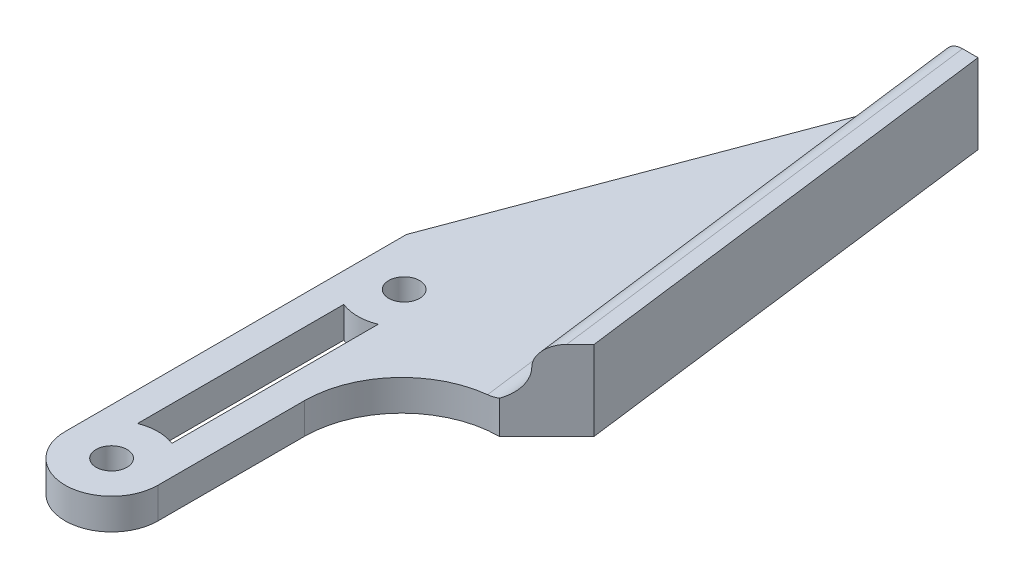
ISO-10303-21;
HEADER;
FILE_DESCRIPTION(('STEP AP214'),'2;1');
FILE_NAME('part.step','',(''),(''),'','','');
FILE_SCHEMA(('AUTOMOTIVE_DESIGN { 1 0 10303 214 1 1 1 1 }'));
ENDSEC;
DATA;
#1=APPLICATION_CONTEXT('core data for automotive mechanical design processes');
#2=APPLICATION_PROTOCOL_DEFINITION('international standard','automotive_design',2000,#1);
#3=PRODUCT_CONTEXT('',#1,'mechanical');
#4=PRODUCT('Part','Part','',(#3));
#5=PRODUCT_RELATED_PRODUCT_CATEGORY('part','',(#4));
#6=PRODUCT_DEFINITION_FORMATION('','',#4);
#7=PRODUCT_DEFINITION_CONTEXT('part definition',#1,'design');
#8=PRODUCT_DEFINITION('design','',#6,#7);
#9=PRODUCT_DEFINITION_SHAPE('','',#8);
#10=(LENGTH_UNIT() NAMED_UNIT(*) SI_UNIT(.MILLI.,.METRE.));
#11=(NAMED_UNIT(*) PLANE_ANGLE_UNIT() SI_UNIT($,.RADIAN.));
#12=(NAMED_UNIT(*) SI_UNIT($,.STERADIAN.) SOLID_ANGLE_UNIT());
#13=UNCERTAINTY_MEASURE_WITH_UNIT(LENGTH_MEASURE(1.E-05),#10,'distance_accuracy_value','');
#14=(GEOMETRIC_REPRESENTATION_CONTEXT(3) GLOBAL_UNCERTAINTY_ASSIGNED_CONTEXT((#13)) GLOBAL_UNIT_ASSIGNED_CONTEXT((#10,
#11,#12)) REPRESENTATION_CONTEXT('',''));
#15=CARTESIAN_POINT('',(0.,0.,0.));
#16=DIRECTION('',(0.,0.,1.));
#17=DIRECTION('',(1.,0.,0.));
#18=AXIS2_PLACEMENT_3D('',#15,#16,#17);
#19=CARTESIAN_POINT('',(7.025,3.175,20.));
#20=DIRECTION('',(0.,-1.,0.));
#21=DIRECTION('',(0.,0.,-1.));
#22=AXIS2_PLACEMENT_3D('',#19,#20,#21);
#23=PLANE('',#22);
#24=CARTESIAN_POINT('',(-7.7375,3.175,35.));
#25=DIRECTION('',(0.,1.,0.));
#26=DIRECTION('',(0.,0.,1.));
#27=AXIS2_PLACEMENT_3D('',#24,#25,#26);
#28=CIRCLE('',#27,1.5875);
#29=CARTESIAN_POINT('',(-7.7375,3.175,36.5875));
#30=VERTEX_POINT('',#29);
#31=EDGE_CURVE('E204',#30,#30,#28,.T.);
#32=ORIENTED_EDGE('',*,*,#31,.F.);
#33=EDGE_LOOP('',(#32));
#34=FACE_BOUND('',#33,.T.);
#35=CARTESIAN_POINT('',(-7.7375,3.175,5.00000000000001));
#36=DIRECTION('',(0.,1.,0.));
#37=DIRECTION('',(0.,0.,1.));
#38=AXIS2_PLACEMENT_3D('',#35,#36,#37);
#39=CIRCLE('',#38,1.5875);
#40=CARTESIAN_POINT('',(-7.7375,3.175,6.58750000000001));
#41=VERTEX_POINT('',#40);
#42=EDGE_CURVE('E210',#41,#41,#39,.T.);
#43=ORIENTED_EDGE('',*,*,#42,.F.);
#44=EDGE_LOOP('',(#43));
#45=FACE_BOUND('',#44,.T.);
#46=CARTESIAN_POINT('',(-7.7375,3.175,35.));
#47=DIRECTION('',(0.,1.,0.));
#48=DIRECTION('',(0.,0.,1.));
#49=AXIS2_PLACEMENT_3D('',#46,#47,#48);
#50=CIRCLE('',#49,4.7625);
#51=CARTESIAN_POINT('',(-5.97499999999999,3.175,30.5756356388742));
#52=VERTEX_POINT('',#51);
#53=CARTESIAN_POINT('',(-9.5,3.175,30.5756356388742));
#54=VERTEX_POINT('',#53);
#55=EDGE_CURVE('E179',#52,#54,#50,.T.);
#56=ORIENTED_EDGE('',*,*,#55,.T.);
#57=DIRECTION('',(0.,0.,1.));
#58=VECTOR('',#57,1.);
#59=CARTESIAN_POINT('',(-9.5,3.175,0.));
#60=LINE('',#59,#58);
#61=CARTESIAN_POINT('',(-9.5,3.175,9.42705531363683));
#62=VERTEX_POINT('',#61);
#63=EDGE_CURVE('E188',#62,#54,#60,.T.);
#64=ORIENTED_EDGE('',*,*,#63,.F.);
#65=CARTESIAN_POINT('',(-7.7375,3.175,5.00000000000001));
#66=DIRECTION('',(0.,1.,0.));
#67=DIRECTION('',(0.,0.,1.));
#68=AXIS2_PLACEMENT_3D('',#65,#66,#67);
#69=CIRCLE('',#68,4.76499999999999);
#70=CARTESIAN_POINT('',(-5.97500000000001,3.175,9.42705531363683));
#71=VERTEX_POINT('',#70);
#72=EDGE_CURVE('E185',#62,#71,#69,.T.);
#73=ORIENTED_EDGE('',*,*,#72,.T.);
#74=DIRECTION('',(0.,0.,1.));
#75=VECTOR('',#74,1.);
#76=CARTESIAN_POINT('',(-5.975,3.175,0.));
#77=LINE('',#76,#75);
#78=EDGE_CURVE('E182',#71,#52,#77,.T.);
#79=ORIENTED_EDGE('',*,*,#78,.T.);
#80=EDGE_LOOP('',(#56,#64,#73,#79));
#81=FACE_BOUND('',#80,.T.);
#82=CARTESIAN_POINT('',(7.025,3.175,20.));
#83=DIRECTION('',(0.,-1.,0.));
#84=DIRECTION('',(0.,0.,-1.));
#85=AXIS2_PLACEMENT_3D('',#82,#83,#84);
#86=CIRCLE('',#85,10.);
#87=CARTESIAN_POINT('',(-2.975,3.175,20.));
#88=VERTEX_POINT('',#87);
#89=CARTESIAN_POINT('',(5.88388487421905,3.175,10.065320525064));
#90=VERTEX_POINT('',#89);
#91=EDGE_CURVE('E218',#88,#90,#86,.T.);
#92=ORIENTED_EDGE('',*,*,#91,.T.);
#93=DIRECTION('',(0.126964135465405,0.,0.991907308323476));
#94=VECTOR('',#93,1.);
#95=CARTESIAN_POINT('',(-0.475721924970433,3.175,-39.6191075936038));
#96=LINE('',#95,#94);
#97=CARTESIAN_POINT('',(0.245171854133337,3.175,-33.9871249443556));
#98=VERTEX_POINT('',#97);
#99=EDGE_CURVE('E265',#90,#98,#96,.F.);
#100=ORIENTED_EDGE('',*,*,#99,.T.);
#101=DIRECTION('',(-0.351123441588392,0.,0.936329177569045));
#102=VECTOR('',#101,1.);
#103=CARTESIAN_POINT('',(2.49999999999999,3.175,-40.));
#104=LINE('',#103,#102);
#105=CARTESIAN_POINT('',(-12.5,3.175,0.));
#106=VERTEX_POINT('',#105);
#107=EDGE_CURVE('E222',#98,#106,#104,.T.);
#108=ORIENTED_EDGE('',*,*,#107,.T.);
#109=DIRECTION('',(0.,0.,1.));
#110=VECTOR('',#109,1.);
#111=CARTESIAN_POINT('',(-12.5,3.175,0.));
#112=LINE('',#111,#110);
#113=CARTESIAN_POINT('',(-12.5,3.175,35.));
#114=VERTEX_POINT('',#113);
#115=EDGE_CURVE('E224',#106,#114,#112,.T.);
#116=ORIENTED_EDGE('',*,*,#115,.T.);
#117=CARTESIAN_POINT('',(-7.7375,3.175,35.));
#118=DIRECTION('',(0.,1.,0.));
#119=DIRECTION('',(0.,0.,1.));
#120=AXIS2_PLACEMENT_3D('',#117,#118,#119);
#121=CIRCLE('',#120,4.76250000000001);
#122=CARTESIAN_POINT('',(-2.975,3.175,35.));
#123=VERTEX_POINT('',#122);
#124=EDGE_CURVE('E173',#114,#123,#121,.T.);
#125=ORIENTED_EDGE('',*,*,#124,.T.);
#126=DIRECTION('',(0.,0.,-1.));
#127=VECTOR('',#126,1.);
#128=CARTESIAN_POINT('',(-2.975,3.175,40.));
#129=LINE('',#128,#127);
#130=EDGE_CURVE('E216',#123,#88,#129,.T.);
#131=ORIENTED_EDGE('',*,*,#130,.T.);
#132=EDGE_LOOP('',(#92,#100,#108,#116,#125,#131));
#133=FACE_BOUND('',#132,.T.);
#134=ADVANCED_FACE('F36',(#34,#45,#81,#133),#23,.F.);
#135=CARTESIAN_POINT('',(7.025,0.,20.));
#136=DIRECTION('',(0.,-1.,0.));
#137=DIRECTION('',(0.,0.,-1.));
#138=AXIS2_PLACEMENT_3D('',#135,#136,#137);
#139=PLANE('',#138);
#140=DIRECTION('',(0.707106781186551,0.,-0.707106781186544));
#141=VECTOR('',#140,1.);
#142=CARTESIAN_POINT('',(2.025,0.,15.));
#143=LINE('',#142,#141);
#144=CARTESIAN_POINT('',(7.025,0.,10.));
#145=VERTEX_POINT('',#144);
#146=CARTESIAN_POINT('',(11.8787234042553,0.,5.14627659574474));
#147=VERTEX_POINT('',#146);
#148=EDGE_CURVE('E158',#145,#147,#143,.T.);
#149=ORIENTED_EDGE('',*,*,#148,.F.);
#150=CARTESIAN_POINT('',(7.025,0.,20.));
#151=DIRECTION('',(0.,-1.,0.));
#152=DIRECTION('',(0.,0.,-1.));
#153=AXIS2_PLACEMENT_3D('',#150,#151,#152);
#154=CIRCLE('',#153,10.);
#155=CARTESIAN_POINT('',(-2.975,0.,20.));
#156=VERTEX_POINT('',#155);
#157=EDGE_CURVE('E229',#156,#145,#154,.T.);
#158=ORIENTED_EDGE('',*,*,#157,.F.);
#159=DIRECTION('',(0.,0.,-1.));
#160=VECTOR('',#159,1.);
#161=CARTESIAN_POINT('',(-2.975,0.,40.));
#162=LINE('',#161,#160);
#163=CARTESIAN_POINT('',(-2.975,0.,35.));
#164=VERTEX_POINT('',#163);
#165=EDGE_CURVE('E213',#164,#156,#162,.T.);
#166=ORIENTED_EDGE('',*,*,#165,.F.);
#167=CARTESIAN_POINT('',(-7.7375,0.,35.));
#168=DIRECTION('',(0.,-1.,0.));
#169=DIRECTION('',(0.,0.,-1.));
#170=AXIS2_PLACEMENT_3D('',#167,#168,#169);
#171=CIRCLE('',#170,4.76250000000001);
#172=CARTESIAN_POINT('',(-12.5,0.,35.));
#173=VERTEX_POINT('',#172);
#174=EDGE_CURVE('E176',#164,#173,#171,.T.);
#175=ORIENTED_EDGE('',*,*,#174,.T.);
#176=DIRECTION('',(0.,0.,1.));
#177=VECTOR('',#176,1.);
#178=CARTESIAN_POINT('',(-12.5,0.,0.));
#179=LINE('',#178,#177);
#180=CARTESIAN_POINT('',(-12.5,0.,0.));
#181=VERTEX_POINT('',#180);
#182=EDGE_CURVE('E219',#181,#173,#179,.T.);
#183=ORIENTED_EDGE('',*,*,#182,.F.);
#184=DIRECTION('',(-0.351123441588392,0.,0.936329177569045));
#185=VECTOR('',#184,1.);
#186=CARTESIAN_POINT('',(2.49999999999999,0.,-40.));
#187=LINE('',#186,#185);
#188=CARTESIAN_POINT('',(2.49999999999999,0.,-40.));
#189=VERTEX_POINT('',#188);
#190=EDGE_CURVE('E233',#189,#181,#187,.T.);
#191=ORIENTED_EDGE('',*,*,#190,.F.);
#192=DIRECTION('',(-1.,0.,0.));
#193=VECTOR('',#192,1.);
#194=CARTESIAN_POINT('',(12.5,0.,-40.));
#195=LINE('',#194,#193);
#196=CARTESIAN_POINT('',(6.09999999999999,0.,-40.));
#197=VERTEX_POINT('',#196);
#198=EDGE_CURVE('E231',#197,#189,#195,.T.);
#199=ORIENTED_EDGE('',*,*,#198,.F.);
#200=DIRECTION('',(0.126964135465405,0.,0.991907308323476));
#201=VECTOR('',#200,1.);
#202=CARTESIAN_POINT('',(12.5,0.,10.));
#203=LINE('',#202,#201);
#204=EDGE_CURVE('E194',#197,#147,#203,.T.);
#205=ORIENTED_EDGE('',*,*,#204,.T.);
#206=EDGE_LOOP('',(#149,#158,#166,#175,#183,#191,#199,#205));
#207=FACE_BOUND('',#206,.T.);
#208=DIRECTION('',(0.,0.,-1.));
#209=VECTOR('',#208,1.);
#210=CARTESIAN_POINT('',(-9.5,0.,20.));
#211=LINE('',#210,#209);
#212=CARTESIAN_POINT('',(-9.5,0.,30.5756356388742));
#213=VERTEX_POINT('',#212);
#214=CARTESIAN_POINT('',(-9.5,0.,9.42705531363683));
#215=VERTEX_POINT('',#214);
#216=EDGE_CURVE('E250',#213,#215,#211,.T.);
#217=ORIENTED_EDGE('',*,*,#216,.F.);
#218=CARTESIAN_POINT('',(-7.7375,0.,35.));
#219=DIRECTION('',(0.,-1.,0.));
#220=DIRECTION('',(0.,0.,-1.));
#221=AXIS2_PLACEMENT_3D('',#218,#219,#220);
#222=CIRCLE('',#221,4.7625);
#223=CARTESIAN_POINT('',(-5.97499999999999,0.,30.5756356388742));
#224=VERTEX_POINT('',#223);
#225=EDGE_CURVE('E252',#213,#224,#222,.T.);
#226=ORIENTED_EDGE('',*,*,#225,.T.);
#227=DIRECTION('',(0.,0.,-1.));
#228=VECTOR('',#227,1.);
#229=CARTESIAN_POINT('',(-5.97499999999999,0.,20.));
#230=LINE('',#229,#228);
#231=CARTESIAN_POINT('',(-5.975,0.,9.42705531363683));
#232=VERTEX_POINT('',#231);
#233=EDGE_CURVE('E244',#224,#232,#230,.T.);
#234=ORIENTED_EDGE('',*,*,#233,.T.);
#235=CARTESIAN_POINT('',(-7.7375,0.,5.00000000000001));
#236=DIRECTION('',(0.,-1.,0.));
#237=DIRECTION('',(0.,0.,-1.));
#238=AXIS2_PLACEMENT_3D('',#235,#236,#237);
#239=CIRCLE('',#238,4.76499999999999);
#240=EDGE_CURVE('E247',#232,#215,#239,.T.);
#241=ORIENTED_EDGE('',*,*,#240,.T.);
#242=EDGE_LOOP('',(#217,#226,#234,#241));
#243=FACE_BOUND('',#242,.T.);
#244=CARTESIAN_POINT('',(-7.7375,0.,5.00000000000001));
#245=DIRECTION('',(0.,1.,0.));
#246=DIRECTION('',(0.,0.,1.));
#247=AXIS2_PLACEMENT_3D('',#244,#245,#246);
#248=CIRCLE('',#247,1.5875);
#249=CARTESIAN_POINT('',(-7.7375,0.,6.58750000000001));
#250=VERTEX_POINT('',#249);
#251=EDGE_CURVE('E207',#250,#250,#248,.T.);
#252=ORIENTED_EDGE('',*,*,#251,.T.);
#253=EDGE_LOOP('',(#252));
#254=FACE_BOUND('',#253,.T.);
#255=CARTESIAN_POINT('',(-7.7375,0.,35.));
#256=DIRECTION('',(0.,1.,0.));
#257=DIRECTION('',(0.,0.,1.));
#258=AXIS2_PLACEMENT_3D('',#255,#256,#257);
#259=CIRCLE('',#258,1.5875);
#260=CARTESIAN_POINT('',(-7.7375,0.,36.5875));
#261=VERTEX_POINT('',#260);
#262=EDGE_CURVE('E203',#261,#261,#259,.T.);
#263=ORIENTED_EDGE('',*,*,#262,.T.);
#264=EDGE_LOOP('',(#263));
#265=FACE_BOUND('',#264,.T.);
#266=ADVANCED_FACE('F282',(#207,#243,#254,#265),#139,.T.);
#267=CARTESIAN_POINT('',(-2.975,3.175,40.));
#268=DIRECTION('',(-1.,0.,0.));
#269=DIRECTION('',(0.,0.,1.));
#270=AXIS2_PLACEMENT_3D('',#267,#268,#269);
#271=PLANE('',#270);
#272=DIRECTION('',(0.,1.,0.));
#273=VECTOR('',#272,1.);
#274=CARTESIAN_POINT('',(-2.975,-6.825,35.));
#275=LINE('',#274,#273);
#276=EDGE_CURVE('E171',#164,#123,#275,.T.);
#277=ORIENTED_EDGE('',*,*,#276,.F.);
#278=ORIENTED_EDGE('',*,*,#165,.T.);
#279=DIRECTION('',(0.,-1.,0.));
#280=VECTOR('',#279,1.);
#281=CARTESIAN_POINT('',(-2.975,3.175,20.));
#282=LINE('',#281,#280);
#283=EDGE_CURVE('E241',#88,#156,#282,.T.);
#284=ORIENTED_EDGE('',*,*,#283,.F.);
#285=ORIENTED_EDGE('',*,*,#130,.F.);
#286=EDGE_LOOP('',(#277,#278,#284,#285));
#287=FACE_BOUND('',#286,.T.);
#288=ADVANCED_FACE('F279',(#287),#271,.F.);
#289=CARTESIAN_POINT('',(7.025,3.175,20.));
#290=DIRECTION('',(0.,-1.,0.));
#291=DIRECTION('',(0.,0.,-1.));
#292=AXIS2_PLACEMENT_3D('',#289,#290,#291);
#293=CYLINDRICAL_SURFACE('',#292,10.);
#294=ORIENTED_EDGE('',*,*,#157,.T.);
#295=DIRECTION('',(0.,-1.,0.));
#296=VECTOR('',#295,1.);
#297=CARTESIAN_POINT('',(7.025,3.175,10.));
#298=LINE('',#297,#296);
#299=CARTESIAN_POINT('',(7.025,3.40011194588368,10.));
#300=VERTEX_POINT('',#299);
#301=EDGE_CURVE('E60',#300,#145,#298,.T.);
#302=ORIENTED_EDGE('',*,*,#301,.F.);
#303=CARTESIAN_POINT('',(7.025,3.40011194588368,10.));
#304=CARTESIAN_POINT('',(6.94857850855718,3.3689551615525,9.99999167668518));
#305=CARTESIAN_POINT('',(6.87089017113675,3.34088685509777,10.0008756179961));
#306=CARTESIAN_POINT('',(6.71348263132809,3.29110632223128,10.0045453354105));
#307=CARTESIAN_POINT('',(6.63376192983926,3.26939894437881,10.0073325569106));
#308=CARTESIAN_POINT('',(6.47426222235149,3.23287691252863,10.0148626859859));
#309=CARTESIAN_POINT('',(6.39450671897227,3.21795253628088,10.0195719343516));
#310=CARTESIAN_POINT('',(6.23423966783054,3.1946069597486,10.0309910264252));
#311=CARTESIAN_POINT('',(6.15372874657802,3.18618078248694,10.0376993335812));
#312=CARTESIAN_POINT('',(6.04164922397388,3.17902941531998,10.0484159936705));
#313=CARTESIAN_POINT('',(6.01015666833825,3.17752168581298,10.0515781910893));
#314=CARTESIAN_POINT('',(5.94706649949416,3.17550539323334,10.058216049866));
#315=CARTESIAN_POINT('',(5.91546888555266,3.17500017305149,10.0616927196885));
#316=CARTESIAN_POINT('',(5.88388487421905,3.175,10.065320525064));
#317=B_SPLINE_CURVE_WITH_KNOTS('',3,(#303,#304,#305,#306,#307,#308,#309,#310,#311,#312,#313,
#314,#315,#316),.UNSPECIFIED.,.F.,.F.,(4,2,2,2,2,2,4),(0.,0.247526549039769,0.495241285032523,
0.7387923564131,0.982156706015518,1.07720350735931,1.17256671542735),.UNSPECIFIED.);
#318=EDGE_CURVE('E45',#300,#90,#317,.T.);
#319=ORIENTED_EDGE('',*,*,#318,.T.);
#320=ORIENTED_EDGE('',*,*,#91,.F.);
#321=ORIENTED_EDGE('',*,*,#283,.T.);
#322=EDGE_LOOP('',(#294,#302,#319,#320,#321));
#323=FACE_BOUND('',#322,.T.);
#324=ADVANCED_FACE('F273',(#323),#293,.F.);
#325=CARTESIAN_POINT('',(12.5,3.175,-40.));
#326=DIRECTION('',(0.,0.,1.));
#327=DIRECTION('',(1.,0.,0.));
#328=AXIS2_PLACEMENT_3D('',#325,#326,#327);
#329=PLANE('',#328);
#330=DIRECTION('',(0.,-1.,0.));
#331=VECTOR('',#330,1.);
#332=CARTESIAN_POINT('',(2.49999999999999,3.175,-40.));
#333=LINE('',#332,#331);
#334=CARTESIAN_POINT('',(2.49999999999999,6.175,-40.));
#335=VERTEX_POINT('',#334);
#336=EDGE_CURVE('E52',#335,#189,#333,.T.);
#337=ORIENTED_EDGE('',*,*,#336,.F.);
#338=CARTESIAN_POINT('',(4.51631743532609,6.175,-40.));
#339=DIRECTION('',(0.,0.,1.));
#340=DIRECTION('',(-1.,0.,0.));
#341=AXIS2_PLACEMENT_3D('',#338,#339,#340);
#342=ELLIPSE('',#341,2.01631743532609,2.);
#343=CARTESIAN_POINT('',(4.51631743532609,8.175,-40.));
#344=VERTEX_POINT('',#343);
#345=EDGE_CURVE('E263',#335,#344,#342,.F.);
#346=ORIENTED_EDGE('',*,*,#345,.T.);
#347=DIRECTION('',(-1.,0.,0.));
#348=VECTOR('',#347,1.);
#349=CARTESIAN_POINT('',(6.09999999999999,8.175,-40.));
#350=LINE('',#349,#348);
#351=CARTESIAN_POINT('',(6.09999999999999,8.175,-40.));
#352=VERTEX_POINT('',#351);
#353=EDGE_CURVE('E166',#352,#344,#350,.T.);
#354=ORIENTED_EDGE('',*,*,#353,.F.);
#355=DIRECTION('',(0.,1.,0.));
#356=VECTOR('',#355,1.);
#357=CARTESIAN_POINT('',(6.09999999999999,0.,-40.));
#358=LINE('',#357,#356);
#359=EDGE_CURVE('E165',#197,#352,#358,.T.);
#360=ORIENTED_EDGE('',*,*,#359,.F.);
#361=ORIENTED_EDGE('',*,*,#198,.T.);
#362=EDGE_LOOP('',(#337,#346,#354,#360,#361));
#363=FACE_BOUND('',#362,.T.);
#364=ADVANCED_FACE('F278',(#363),#329,.F.);
#365=CARTESIAN_POINT('',(2.49999999999999,3.175,-40.));
#366=DIRECTION('',(0.936329177569044,0.,0.351123441588392));
#367=DIRECTION('',(0.351123441588392,0.,-0.936329177569045));
#368=AXIS2_PLACEMENT_3D('',#365,#366,#367);
#369=PLANE('',#368);
#370=ORIENTED_EDGE('',*,*,#190,.T.);
#371=DIRECTION('',(0.,-1.,0.));
#372=VECTOR('',#371,1.);
#373=CARTESIAN_POINT('',(-12.5,3.175,0.));
#374=LINE('',#373,#372);
#375=EDGE_CURVE('E227',#106,#181,#374,.T.);
#376=ORIENTED_EDGE('',*,*,#375,.F.);
#377=ORIENTED_EDGE('',*,*,#107,.F.);
#378=CARTESIAN_POINT('',(0.245171854133338,6.175,-33.9871249443556));
#379=DIRECTION('',(0.936329177569044,0.,0.351123441588392));
#380=DIRECTION('',(0.351123441588392,0.,-0.936329177569045));
#381=AXIS2_PLACEMENT_3D('',#378,#379,#380);
#382=ELLIPSE('',#381,6.42175337444403,3.);
#383=EDGE_CURVE('E11',#98,#335,#382,.T.);
#384=ORIENTED_EDGE('',*,*,#383,.T.);
#385=ORIENTED_EDGE('',*,*,#336,.T.);
#386=EDGE_LOOP('',(#370,#376,#377,#384,#385));
#387=FACE_BOUND('',#386,.T.);
#388=ADVANCED_FACE('F309',(#387),#369,.F.);
#389=CARTESIAN_POINT('',(-12.5,3.175,0.));
#390=DIRECTION('',(1.,0.,0.));
#391=DIRECTION('',(0.,0.,-1.));
#392=AXIS2_PLACEMENT_3D('',#389,#390,#391);
#393=PLANE('',#392);
#394=ORIENTED_EDGE('',*,*,#182,.T.);
#395=DIRECTION('',(0.,1.,0.));
#396=VECTOR('',#395,1.);
#397=CARTESIAN_POINT('',(-12.5,-6.825,35.));
#398=LINE('',#397,#396);
#399=EDGE_CURVE('E161',#173,#114,#398,.T.);
#400=ORIENTED_EDGE('',*,*,#399,.T.);
#401=ORIENTED_EDGE('',*,*,#115,.F.);
#402=ORIENTED_EDGE('',*,*,#375,.T.);
#403=EDGE_LOOP('',(#394,#400,#401,#402));
#404=FACE_BOUND('',#403,.T.);
#405=ADVANCED_FACE('F307',(#404),#393,.F.);
#406=CARTESIAN_POINT('',(-7.7375,3.175,5.00000000000001));
#407=DIRECTION('',(0.,-1.,0.));
#408=DIRECTION('',(0.,0.,-1.));
#409=AXIS2_PLACEMENT_3D('',#406,#407,#408);
#410=CYLINDRICAL_SURFACE('',#409,1.5875);
#411=ORIENTED_EDGE('',*,*,#42,.T.);
#412=EDGE_LOOP('',(#411));
#413=FACE_BOUND('',#412,.T.);
#414=ORIENTED_EDGE('',*,*,#251,.F.);
#415=EDGE_LOOP('',(#414));
#416=FACE_BOUND('',#415,.T.);
#417=ADVANCED_FACE('F304',(#413,#416),#410,.F.);
#418=CARTESIAN_POINT('',(-7.7375,3.175,35.));
#419=DIRECTION('',(0.,-1.,0.));
#420=DIRECTION('',(0.,0.,-1.));
#421=AXIS2_PLACEMENT_3D('',#418,#419,#420);
#422=CYLINDRICAL_SURFACE('',#421,1.5875);
#423=ORIENTED_EDGE('',*,*,#31,.T.);
#424=EDGE_LOOP('',(#423));
#425=FACE_BOUND('',#424,.T.);
#426=ORIENTED_EDGE('',*,*,#262,.F.);
#427=EDGE_LOOP('',(#426));
#428=FACE_BOUND('',#427,.T.);
#429=ADVANCED_FACE('F360',(#425,#428),#422,.F.);
#430=CARTESIAN_POINT('',(12.5,0.,10.));
#431=DIRECTION('',(-0.991907308323476,0.,0.126964135465405));
#432=DIRECTION('',(0.126964135465405,0.,0.991907308323476));
#433=AXIS2_PLACEMENT_3D('',#430,#431,#432);
#434=PLANE('',#433);
#435=ORIENTED_EDGE('',*,*,#359,.T.);
#436=DIRECTION('',(-0.126964135465405,0.,-0.991907308323475));
#437=VECTOR('',#436,1.);
#438=CARTESIAN_POINT('',(11.8787234042553,8.175,5.14627659574474));
#439=LINE('',#438,#437);
#440=CARTESIAN_POINT('',(11.8787234042553,8.175,5.14627659574474));
#441=VERTEX_POINT('',#440);
#442=EDGE_CURVE('E147',#441,#352,#439,.T.);
#443=ORIENTED_EDGE('',*,*,#442,.F.);
#444=DIRECTION('',(0.,-1.,0.));
#445=VECTOR('',#444,1.);
#446=CARTESIAN_POINT('',(11.8787234042553,0.,5.14627659574474));
#447=LINE('',#446,#445);
#448=EDGE_CURVE('E155',#441,#147,#447,.T.);
#449=ORIENTED_EDGE('',*,*,#448,.T.);
#450=ORIENTED_EDGE('',*,*,#204,.F.);
#451=EDGE_LOOP('',(#435,#443,#449,#450));
#452=FACE_BOUND('',#451,.T.);
#453=ADVANCED_FACE('F163',(#452),#434,.F.);
#454=CARTESIAN_POINT('',(-7.7375,-6.825,35.));
#455=DIRECTION('',(0.,1.,0.));
#456=DIRECTION('',(0.,0.,1.));
#457=AXIS2_PLACEMENT_3D('',#454,#455,#456);
#458=CYLINDRICAL_SURFACE('',#457,4.7625);
#459=DIRECTION('',(0.,1.,0.));
#460=VECTOR('',#459,1.);
#461=CARTESIAN_POINT('',(-9.5,-6.825,30.5756356388742));
#462=LINE('',#461,#460);
#463=EDGE_CURVE('E192',#213,#54,#462,.T.);
#464=ORIENTED_EDGE('',*,*,#463,.T.);
#465=ORIENTED_EDGE('',*,*,#55,.F.);
#466=DIRECTION('',(0.,1.,0.));
#467=VECTOR('',#466,1.);
#468=CARTESIAN_POINT('',(-5.97499999999999,-6.825,30.5756356388742));
#469=LINE('',#468,#467);
#470=EDGE_CURVE('E191',#224,#52,#469,.T.);
#471=ORIENTED_EDGE('',*,*,#470,.F.);
#472=ORIENTED_EDGE('',*,*,#225,.F.);
#473=EDGE_LOOP('',(#464,#465,#471,#472));
#474=FACE_BOUND('',#473,.T.);
#475=ADVANCED_FACE('F351',(#474),#458,.T.);
#476=CARTESIAN_POINT('',(-9.5,-6.825,0.));
#477=DIRECTION('',(-1.,0.,0.));
#478=DIRECTION('',(0.,0.,1.));
#479=AXIS2_PLACEMENT_3D('',#476,#477,#478);
#480=PLANE('',#479);
#481=ORIENTED_EDGE('',*,*,#216,.T.);
#482=DIRECTION('',(0.,1.,0.));
#483=VECTOR('',#482,1.);
#484=CARTESIAN_POINT('',(-9.5,-6.825,9.42705531363683));
#485=LINE('',#484,#483);
#486=EDGE_CURVE('E195',#215,#62,#485,.T.);
#487=ORIENTED_EDGE('',*,*,#486,.T.);
#488=ORIENTED_EDGE('',*,*,#63,.T.);
#489=ORIENTED_EDGE('',*,*,#463,.F.);
#490=EDGE_LOOP('',(#481,#487,#488,#489));
#491=FACE_BOUND('',#490,.T.);
#492=ADVANCED_FACE('F348',(#491),#480,.F.);
#493=CARTESIAN_POINT('',(-7.7375,-6.825,5.00000000000001));
#494=DIRECTION('',(0.,1.,0.));
#495=DIRECTION('',(0.,0.,1.));
#496=AXIS2_PLACEMENT_3D('',#493,#494,#495);
#497=CYLINDRICAL_SURFACE('',#496,4.76499999999999);
#498=DIRECTION('',(0.,1.,0.));
#499=VECTOR('',#498,1.);
#500=CARTESIAN_POINT('',(-5.97500000000001,-6.825,9.42705531363683));
#501=LINE('',#500,#499);
#502=EDGE_CURVE('E197',#232,#71,#501,.T.);
#503=ORIENTED_EDGE('',*,*,#502,.T.);
#504=ORIENTED_EDGE('',*,*,#72,.F.);
#505=ORIENTED_EDGE('',*,*,#486,.F.);
#506=ORIENTED_EDGE('',*,*,#240,.F.);
#507=EDGE_LOOP('',(#503,#504,#505,#506));
#508=FACE_BOUND('',#507,.T.);
#509=ADVANCED_FACE('F344',(#508),#497,.T.);
#510=CARTESIAN_POINT('',(-5.975,-6.825,0.));
#511=DIRECTION('',(-1.,0.,0.));
#512=DIRECTION('',(0.,0.,1.));
#513=AXIS2_PLACEMENT_3D('',#510,#511,#512);
#514=PLANE('',#513);
#515=ORIENTED_EDGE('',*,*,#470,.T.);
#516=ORIENTED_EDGE('',*,*,#78,.F.);
#517=ORIENTED_EDGE('',*,*,#502,.F.);
#518=ORIENTED_EDGE('',*,*,#233,.F.);
#519=EDGE_LOOP('',(#515,#516,#517,#518));
#520=FACE_BOUND('',#519,.T.);
#521=ADVANCED_FACE('F337',(#520),#514,.T.);
#522=CARTESIAN_POINT('',(-7.7375,-6.825,35.));
#523=DIRECTION('',(0.,1.,0.));
#524=DIRECTION('',(0.,0.,1.));
#525=AXIS2_PLACEMENT_3D('',#522,#523,#524);
#526=CYLINDRICAL_SURFACE('',#525,4.76250000000001);
#527=ORIENTED_EDGE('',*,*,#276,.T.);
#528=ORIENTED_EDGE('',*,*,#124,.F.);
#529=ORIENTED_EDGE('',*,*,#399,.F.);
#530=ORIENTED_EDGE('',*,*,#174,.F.);
#531=EDGE_LOOP('',(#527,#528,#529,#530));
#532=FACE_BOUND('',#531,.T.);
#533=ADVANCED_FACE('F327',(#532),#526,.T.);
#534=CARTESIAN_POINT('',(7.025,-6.825,10.));
#535=DIRECTION('',(-0.707106781186544,0.,-0.707106781186551));
#536=DIRECTION('',(-0.707106781186551,0.,0.707106781186544));
#537=AXIS2_PLACEMENT_3D('',#534,#535,#536);
#538=PLANE('',#537);
#539=DIRECTION('',(0.707106781186551,0.,-0.707106781186544));
#540=VECTOR('',#539,1.);
#541=CARTESIAN_POINT('',(8.68723404255319,8.175,8.33776595744684));
#542=LINE('',#541,#540);
#543=CARTESIAN_POINT('',(10.4747494994026,8.175,6.55025050059748));
#544=VERTEX_POINT('',#543);
#545=EDGE_CURVE('E142',#544,#441,#542,.T.);
#546=ORIENTED_EDGE('',*,*,#545,.F.);
#547=CARTESIAN_POINT('',(10.4747494994026,6.175,6.55025050059748));
#548=DIRECTION('',(-0.707106781186544,0.,-0.707106781186551));
#549=DIRECTION('',(0.707106781186551,0.,-0.707106781186544));
#550=AXIS2_PLACEMENT_3D('',#547,#548,#549);
#551=ELLIPSE('',#550,2.52792860202791,2.);
#552=CARTESIAN_POINT('',(8.68723404255319,6.175,8.33776595744684));
#553=VERTEX_POINT('',#552);
#554=EDGE_CURVE('E258',#544,#553,#551,.F.);
#555=ORIENTED_EDGE('',*,*,#554,.T.);
#556=CARTESIAN_POINT('',(6.00596085727913,6.175,11.0190391427209));
#557=DIRECTION('',(-0.707106781186544,0.,-0.707106781186551));
#558=DIRECTION('',(0.707106781186551,0.,-0.707106781186544));
#559=AXIS2_PLACEMENT_3D('',#556,#557,#558);
#560=ELLIPSE('',#559,3.79189290304187,3.);
#561=EDGE_CURVE('E267',#553,#300,#560,.T.);
#562=ORIENTED_EDGE('',*,*,#561,.T.);
#563=ORIENTED_EDGE('',*,*,#301,.T.);
#564=ORIENTED_EDGE('',*,*,#148,.T.);
#565=ORIENTED_EDGE('',*,*,#448,.F.);
#566=EDGE_LOOP('',(#546,#555,#562,#563,#564,#565));
#567=FACE_BOUND('',#566,.T.);
#568=ADVANCED_FACE('F156',(#567),#538,.F.);
#569=CARTESIAN_POINT('',(0.,8.175,0.));
#570=DIRECTION('',(0.,1.,0.));
#571=DIRECTION('',(0.,0.,1.));
#572=AXIS2_PLACEMENT_3D('',#569,#570,#571);
#573=PLANE('',#572);
#574=ORIENTED_EDGE('',*,*,#353,.T.);
#575=DIRECTION('',(0.126964135465405,0.,0.991907308323476));
#576=VECTOR('',#575,1.);
#577=CARTESIAN_POINT('',(10.6710486592001,8.175,8.08383768651603));
#578=LINE('',#577,#576);
#579=EDGE_CURVE('E150',#344,#544,#578,.T.);
#580=ORIENTED_EDGE('',*,*,#579,.T.);
#581=ORIENTED_EDGE('',*,*,#545,.T.);
#582=ORIENTED_EDGE('',*,*,#442,.T.);
#583=EDGE_LOOP('',(#574,#580,#581,#582));
#584=FACE_BOUND('',#583,.T.);
#585=ADVANCED_FACE('F145',(#584),#573,.T.);
#586=CARTESIAN_POINT('',(9.48098104193503,6.175,-1.21356557336768));
#587=DIRECTION('',(-0.126964135465405,0.,-0.991907308323476));
#588=DIRECTION('',(-0.991907308323476,0.,0.126964135465405));
#589=AXIS2_PLACEMENT_3D('',#586,#587,#588);
#590=CYLINDRICAL_SURFACE('',#589,2.);
#591=ORIENTED_EDGE('',*,*,#345,.F.);
#592=DIRECTION('',(0.126964135465405,0.,0.991907308323476));
#593=VECTOR('',#592,1.);
#594=CARTESIAN_POINT('',(2.49999999999999,6.175,-40.));
#595=LINE('',#594,#593);
#596=EDGE_CURVE('E260',#553,#335,#595,.F.);
#597=ORIENTED_EDGE('',*,*,#596,.F.);
#598=ORIENTED_EDGE('',*,*,#554,.F.);
#599=ORIENTED_EDGE('',*,*,#579,.F.);
#600=EDGE_LOOP('',(#591,#597,#598,#599));
#601=FACE_BOUND('',#600,.T.);
#602=ADVANCED_FACE('F284',(#601),#590,.T.);
#603=CARTESIAN_POINT('',(-0.475721924970433,6.175,-39.6191075936038));
#604=DIRECTION('',(-0.126964135465405,0.,-0.991907308323476));
#605=DIRECTION('',(-0.991907308323476,0.,0.126964135465405));
#606=AXIS2_PLACEMENT_3D('',#603,#604,#605);
#607=CYLINDRICAL_SURFACE('',#606,3.);
#608=ORIENTED_EDGE('',*,*,#383,.F.);
#609=ORIENTED_EDGE('',*,*,#99,.F.);
#610=ORIENTED_EDGE('',*,*,#318,.F.);
#611=ORIENTED_EDGE('',*,*,#561,.F.);
#612=ORIENTED_EDGE('',*,*,#596,.T.);
#613=EDGE_LOOP('',(#608,#609,#610,#611,#612));
#614=FACE_BOUND('',#613,.T.);
#615=ADVANCED_FACE('F38',(#614),#607,.F.);
#616=CLOSED_SHELL('',(#134,#266,#288,#324,#364,#388,#405,#417,#429,#453,#475,#492,#509,#521,
#533,#568,#585,#602,#615));
#617=MANIFOLD_SOLID_BREP('B2',#616);
#618=ADVANCED_BREP_SHAPE_REPRESENTATION('',(#18,#617),#14);
#619=SHAPE_DEFINITION_REPRESENTATION(#9,#618);
ENDSEC;
END-ISO-10303-21;
